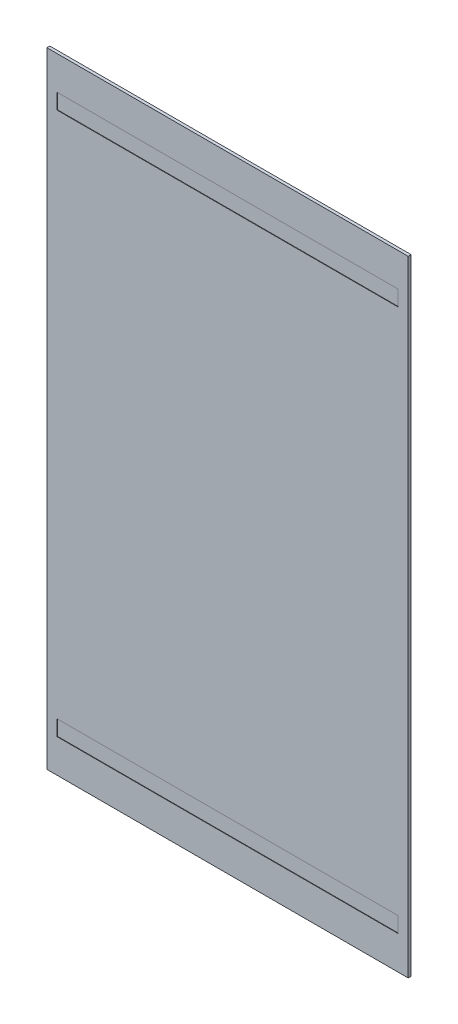
ISO-10303-21;
HEADER;
FILE_DESCRIPTION(('STEP AP214'),'2;1');
FILE_NAME('part.step','',(''),(''),'','','');
FILE_SCHEMA(('AUTOMOTIVE_DESIGN { 1 0 10303 214 1 1 1 1 }'));
ENDSEC;
DATA;
#1=APPLICATION_CONTEXT('core data for automotive mechanical design processes');
#2=APPLICATION_PROTOCOL_DEFINITION('international standard','automotive_design',2000,#1);
#3=PRODUCT_CONTEXT('',#1,'mechanical');
#4=PRODUCT('Part','Part','',(#3));
#5=PRODUCT_RELATED_PRODUCT_CATEGORY('part','',(#4));
#6=PRODUCT_DEFINITION_FORMATION('','',#4);
#7=PRODUCT_DEFINITION_CONTEXT('part definition',#1,'design');
#8=PRODUCT_DEFINITION('design','',#6,#7);
#9=PRODUCT_DEFINITION_SHAPE('','',#8);
#10=(LENGTH_UNIT() NAMED_UNIT(*) SI_UNIT(.MILLI.,.METRE.));
#11=(NAMED_UNIT(*) PLANE_ANGLE_UNIT() SI_UNIT($,.RADIAN.));
#12=(NAMED_UNIT(*) SI_UNIT($,.STERADIAN.) SOLID_ANGLE_UNIT());
#13=UNCERTAINTY_MEASURE_WITH_UNIT(LENGTH_MEASURE(1.E-05),#10,'distance_accuracy_value','');
#14=(GEOMETRIC_REPRESENTATION_CONTEXT(3) GLOBAL_UNCERTAINTY_ASSIGNED_CONTEXT((#13)) GLOBAL_UNIT_ASSIGNED_CONTEXT((#10,
#11,#12)) REPRESENTATION_CONTEXT('',''));
#15=CARTESIAN_POINT('',(0.,0.,0.));
#16=DIRECTION('',(0.,0.,1.));
#17=DIRECTION('',(1.,0.,0.));
#18=AXIS2_PLACEMENT_3D('',#15,#16,#17);
#19=CARTESIAN_POINT('',(-18.5,32.,0.3));
#20=DIRECTION('',(1.,0.,0.));
#21=DIRECTION('',(0.,0.,-1.));
#22=AXIS2_PLACEMENT_3D('',#19,#20,#21);
#23=PLANE('',#22);
#24=DIRECTION('',(0.,-1.,0.));
#25=VECTOR('',#24,1.);
#26=CARTESIAN_POINT('',(-18.5,32.,0.));
#27=LINE('',#26,#25);
#28=CARTESIAN_POINT('',(-18.5,32.,0.));
#29=VERTEX_POINT('',#28);
#30=CARTESIAN_POINT('',(-18.5,-32.,0.));
#31=VERTEX_POINT('',#30);
#32=EDGE_CURVE('E182',#29,#31,#27,.T.);
#33=ORIENTED_EDGE('',*,*,#32,.T.);
#34=DIRECTION('',(0.,0.,-1.));
#35=VECTOR('',#34,1.);
#36=CARTESIAN_POINT('',(-18.5,-32.,0.3));
#37=LINE('',#36,#35);
#38=CARTESIAN_POINT('',(-18.5,-32.,0.3));
#39=VERTEX_POINT('',#38);
#40=EDGE_CURVE('E11',#39,#31,#37,.T.);
#41=ORIENTED_EDGE('',*,*,#40,.F.);
#42=DIRECTION('',(0.,-1.,0.));
#43=VECTOR('',#42,1.);
#44=CARTESIAN_POINT('',(-18.5,32.,0.3));
#45=LINE('',#44,#43);
#46=CARTESIAN_POINT('',(-18.5,32.,0.3));
#47=VERTEX_POINT('',#46);
#48=EDGE_CURVE('E196',#47,#39,#45,.T.);
#49=ORIENTED_EDGE('',*,*,#48,.F.);
#50=DIRECTION('',(0.,0.,-1.));
#51=VECTOR('',#50,1.);
#52=CARTESIAN_POINT('',(-18.5,32.,0.3));
#53=LINE('',#52,#51);
#54=EDGE_CURVE('E205',#47,#29,#53,.T.);
#55=ORIENTED_EDGE('',*,*,#54,.T.);
#56=EDGE_LOOP('',(#33,#41,#49,#55));
#57=FACE_BOUND('',#56,.T.);
#58=ADVANCED_FACE('F29',(#57),#23,.F.);
#59=CARTESIAN_POINT('',(-18.5,-32.,0.3));
#60=DIRECTION('',(0.,1.,0.));
#61=DIRECTION('',(0.,0.,1.));
#62=AXIS2_PLACEMENT_3D('',#59,#60,#61);
#63=PLANE('',#62);
#64=DIRECTION('',(1.,0.,0.));
#65=VECTOR('',#64,1.);
#66=CARTESIAN_POINT('',(-18.5,-32.,0.));
#67=LINE('',#66,#65);
#68=CARTESIAN_POINT('',(18.5,-32.,0.));
#69=VERTEX_POINT('',#68);
#70=EDGE_CURVE('E190',#31,#69,#67,.T.);
#71=ORIENTED_EDGE('',*,*,#70,.T.);
#72=DIRECTION('',(0.,0.,-1.));
#73=VECTOR('',#72,1.);
#74=CARTESIAN_POINT('',(18.5,-32.,0.3));
#75=LINE('',#74,#73);
#76=CARTESIAN_POINT('',(18.5,-32.,0.3));
#77=VERTEX_POINT('',#76);
#78=EDGE_CURVE('E36',#77,#69,#75,.T.);
#79=ORIENTED_EDGE('',*,*,#78,.F.);
#80=DIRECTION('',(1.,0.,0.));
#81=VECTOR('',#80,1.);
#82=CARTESIAN_POINT('',(-18.5,-32.,0.3));
#83=LINE('',#82,#81);
#84=EDGE_CURVE('E199',#39,#77,#83,.T.);
#85=ORIENTED_EDGE('',*,*,#84,.F.);
#86=ORIENTED_EDGE('',*,*,#40,.T.);
#87=EDGE_LOOP('',(#71,#79,#85,#86));
#88=FACE_BOUND('',#87,.T.);
#89=ADVANCED_FACE('F230',(#88),#63,.F.);
#90=CARTESIAN_POINT('',(18.5,32.,0.3));
#91=DIRECTION('',(-1.,0.,0.));
#92=DIRECTION('',(0.,-1.,0.));
#93=AXIS2_PLACEMENT_3D('',#90,#91,#92);
#94=PLANE('',#93);
#95=DIRECTION('',(0.,1.,0.));
#96=VECTOR('',#95,1.);
#97=CARTESIAN_POINT('',(18.5,32.,0.));
#98=LINE('',#97,#96);
#99=CARTESIAN_POINT('',(18.5,32.,0.));
#100=VERTEX_POINT('',#99);
#101=EDGE_CURVE('E192',#69,#100,#98,.T.);
#102=ORIENTED_EDGE('',*,*,#101,.T.);
#103=DIRECTION('',(0.,0.,-1.));
#104=VECTOR('',#103,1.);
#105=CARTESIAN_POINT('',(18.5,32.,0.3));
#106=LINE('',#105,#104);
#107=CARTESIAN_POINT('',(18.5,32.,0.3));
#108=VERTEX_POINT('',#107);
#109=EDGE_CURVE('E208',#108,#100,#106,.T.);
#110=ORIENTED_EDGE('',*,*,#109,.F.);
#111=DIRECTION('',(0.,1.,0.));
#112=VECTOR('',#111,1.);
#113=CARTESIAN_POINT('',(18.5,32.,0.3));
#114=LINE('',#113,#112);
#115=EDGE_CURVE('E201',#77,#108,#114,.T.);
#116=ORIENTED_EDGE('',*,*,#115,.F.);
#117=ORIENTED_EDGE('',*,*,#78,.T.);
#118=EDGE_LOOP('',(#102,#110,#116,#117));
#119=FACE_BOUND('',#118,.T.);
#120=ADVANCED_FACE('F215',(#119),#94,.F.);
#121=CARTESIAN_POINT('',(-18.5,32.,0.3));
#122=DIRECTION('',(0.,-1.,0.));
#123=DIRECTION('',(0.,0.,-1.));
#124=AXIS2_PLACEMENT_3D('',#121,#122,#123);
#125=PLANE('',#124);
#126=DIRECTION('',(-1.,0.,0.));
#127=VECTOR('',#126,1.);
#128=CARTESIAN_POINT('',(-18.5,32.,0.));
#129=LINE('',#128,#127);
#130=EDGE_CURVE('E194',#100,#29,#129,.T.);
#131=ORIENTED_EDGE('',*,*,#130,.T.);
#132=ORIENTED_EDGE('',*,*,#54,.F.);
#133=DIRECTION('',(-1.,0.,0.));
#134=VECTOR('',#133,1.);
#135=CARTESIAN_POINT('',(-18.5,32.,0.3));
#136=LINE('',#135,#134);
#137=EDGE_CURVE('E203',#108,#47,#136,.T.);
#138=ORIENTED_EDGE('',*,*,#137,.F.);
#139=ORIENTED_EDGE('',*,*,#109,.T.);
#140=EDGE_LOOP('',(#131,#132,#138,#139));
#141=FACE_BOUND('',#140,.T.);
#142=ADVANCED_FACE('F224',(#141),#125,.F.);
#143=CARTESIAN_POINT('',(-18.5,-32.,0.3));
#144=DIRECTION('',(0.,0.,1.));
#145=DIRECTION('',(1.,0.,0.));
#146=AXIS2_PLACEMENT_3D('',#143,#144,#145);
#147=PLANE('',#146);
#148=DIRECTION('',(-1.,0.,0.));
#149=VECTOR('',#148,1.);
#150=CARTESIAN_POINT('',(-17.4625,-26.9875,0.3));
#151=LINE('',#150,#149);
#152=CARTESIAN_POINT('',(17.4625,-26.9875,0.3));
#153=VERTEX_POINT('',#152);
#154=CARTESIAN_POINT('',(-17.4625,-26.9875,0.3));
#155=VERTEX_POINT('',#154);
#156=EDGE_CURVE('E139',#153,#155,#151,.T.);
#157=ORIENTED_EDGE('',*,*,#156,.F.);
#158=DIRECTION('',(0.,1.,0.));
#159=VECTOR('',#158,1.);
#160=CARTESIAN_POINT('',(17.4625,-26.9875,0.3));
#161=LINE('',#160,#159);
#162=CARTESIAN_POINT('',(17.4625,-28.575,0.3));
#163=VERTEX_POINT('',#162);
#164=EDGE_CURVE('E121',#163,#153,#161,.T.);
#165=ORIENTED_EDGE('',*,*,#164,.F.);
#166=DIRECTION('',(1.,0.,0.));
#167=VECTOR('',#166,1.);
#168=CARTESIAN_POINT('',(-17.4625,-28.575,0.3));
#169=LINE('',#168,#167);
#170=CARTESIAN_POINT('',(-17.4625,-28.575,0.3));
#171=VERTEX_POINT('',#170);
#172=EDGE_CURVE('E132',#171,#163,#169,.T.);
#173=ORIENTED_EDGE('',*,*,#172,.F.);
#174=DIRECTION('',(0.,-1.,0.));
#175=VECTOR('',#174,1.);
#176=CARTESIAN_POINT('',(-17.4625,-26.9875,0.3));
#177=LINE('',#176,#175);
#178=EDGE_CURVE('E43',#155,#171,#177,.T.);
#179=ORIENTED_EDGE('',*,*,#178,.F.);
#180=EDGE_LOOP('',(#157,#165,#173,#179));
#181=FACE_BOUND('',#180,.T.);
#182=DIRECTION('',(-1.,0.,0.));
#183=VECTOR('',#182,1.);
#184=CARTESIAN_POINT('',(-17.4625,28.575,0.3));
#185=LINE('',#184,#183);
#186=CARTESIAN_POINT('',(17.4625,28.575,0.3));
#187=VERTEX_POINT('',#186);
#188=CARTESIAN_POINT('',(-17.4625,28.575,0.3));
#189=VERTEX_POINT('',#188);
#190=EDGE_CURVE('E164',#187,#189,#185,.T.);
#191=ORIENTED_EDGE('',*,*,#190,.F.);
#192=DIRECTION('',(0.,1.,0.));
#193=VECTOR('',#192,1.);
#194=CARTESIAN_POINT('',(17.4625,28.575,0.3));
#195=LINE('',#194,#193);
#196=CARTESIAN_POINT('',(17.4625,26.9875,0.3));
#197=VERTEX_POINT('',#196);
#198=EDGE_CURVE('E161',#197,#187,#195,.T.);
#199=ORIENTED_EDGE('',*,*,#198,.F.);
#200=DIRECTION('',(1.,0.,0.));
#201=VECTOR('',#200,1.);
#202=CARTESIAN_POINT('',(-17.4625,26.9875,0.3));
#203=LINE('',#202,#201);
#204=CARTESIAN_POINT('',(-17.4625,26.9875,0.3));
#205=VERTEX_POINT('',#204);
#206=EDGE_CURVE('E158',#205,#197,#203,.T.);
#207=ORIENTED_EDGE('',*,*,#206,.F.);
#208=DIRECTION('',(0.,-1.,0.));
#209=VECTOR('',#208,1.);
#210=CARTESIAN_POINT('',(-17.4625,28.575,0.3));
#211=LINE('',#210,#209);
#212=EDGE_CURVE('E51',#189,#205,#211,.T.);
#213=ORIENTED_EDGE('',*,*,#212,.F.);
#214=EDGE_LOOP('',(#191,#199,#207,#213));
#215=FACE_BOUND('',#214,.T.);
#216=ORIENTED_EDGE('',*,*,#48,.T.);
#217=ORIENTED_EDGE('',*,*,#84,.T.);
#218=ORIENTED_EDGE('',*,*,#115,.T.);
#219=ORIENTED_EDGE('',*,*,#137,.T.);
#220=EDGE_LOOP('',(#216,#217,#218,#219));
#221=FACE_BOUND('',#220,.T.);
#222=ADVANCED_FACE('F136',(#181,#215,#221),#147,.T.);
#223=CARTESIAN_POINT('',(-18.5,-32.,0.));
#224=DIRECTION('',(0.,0.,1.));
#225=DIRECTION('',(1.,0.,0.));
#226=AXIS2_PLACEMENT_3D('',#223,#224,#225);
#227=PLANE('',#226);
#228=ORIENTED_EDGE('',*,*,#32,.F.);
#229=ORIENTED_EDGE('',*,*,#130,.F.);
#230=ORIENTED_EDGE('',*,*,#101,.F.);
#231=ORIENTED_EDGE('',*,*,#70,.F.);
#232=EDGE_LOOP('',(#228,#229,#230,#231));
#233=FACE_BOUND('',#232,.T.);
#234=ADVANCED_FACE('F221',(#233),#227,.F.);
#235=CARTESIAN_POINT('',(-17.4625,28.575,0.25));
#236=DIRECTION('',(-1.,0.,0.));
#237=DIRECTION('',(0.,0.,1.));
#238=AXIS2_PLACEMENT_3D('',#235,#236,#237);
#239=PLANE('',#238);
#240=ORIENTED_EDGE('',*,*,#212,.T.);
#241=DIRECTION('',(0.,0.,1.));
#242=VECTOR('',#241,1.);
#243=CARTESIAN_POINT('',(-17.4625,26.9875,0.25));
#244=LINE('',#243,#242);
#245=CARTESIAN_POINT('',(-17.4625,26.9875,0.25));
#246=VERTEX_POINT('',#245);
#247=EDGE_CURVE('E179',#246,#205,#244,.T.);
#248=ORIENTED_EDGE('',*,*,#247,.F.);
#249=DIRECTION('',(0.,-1.,0.));
#250=VECTOR('',#249,1.);
#251=CARTESIAN_POINT('',(-17.4625,28.575,0.25));
#252=LINE('',#251,#250);
#253=CARTESIAN_POINT('',(-17.4625,28.575,0.25));
#254=VERTEX_POINT('',#253);
#255=EDGE_CURVE('E167',#254,#246,#252,.T.);
#256=ORIENTED_EDGE('',*,*,#255,.F.);
#257=DIRECTION('',(0.,0.,1.));
#258=VECTOR('',#257,1.);
#259=CARTESIAN_POINT('',(-17.4625,28.575,0.25));
#260=LINE('',#259,#258);
#261=EDGE_CURVE('E180',#254,#189,#260,.T.);
#262=ORIENTED_EDGE('',*,*,#261,.T.);
#263=EDGE_LOOP('',(#240,#248,#256,#262));
#264=FACE_BOUND('',#263,.T.);
#265=ADVANCED_FACE('F244',(#264),#239,.F.);
#266=CARTESIAN_POINT('',(-17.4625,28.575,0.25));
#267=DIRECTION('',(0.,1.,0.));
#268=DIRECTION('',(0.,0.,1.));
#269=AXIS2_PLACEMENT_3D('',#266,#267,#268);
#270=PLANE('',#269);
#271=ORIENTED_EDGE('',*,*,#190,.T.);
#272=ORIENTED_EDGE('',*,*,#261,.F.);
#273=DIRECTION('',(-1.,0.,0.));
#274=VECTOR('',#273,1.);
#275=CARTESIAN_POINT('',(-17.4625,28.575,0.25));
#276=LINE('',#275,#274);
#277=CARTESIAN_POINT('',(17.4625,28.575,0.25));
#278=VERTEX_POINT('',#277);
#279=EDGE_CURVE('E176',#278,#254,#276,.T.);
#280=ORIENTED_EDGE('',*,*,#279,.F.);
#281=DIRECTION('',(0.,0.,1.));
#282=VECTOR('',#281,1.);
#283=CARTESIAN_POINT('',(17.4625,28.575,0.25));
#284=LINE('',#283,#282);
#285=EDGE_CURVE('E183',#278,#187,#284,.T.);
#286=ORIENTED_EDGE('',*,*,#285,.T.);
#287=EDGE_LOOP('',(#271,#272,#280,#286));
#288=FACE_BOUND('',#287,.T.);
#289=ADVANCED_FACE('F247',(#288),#270,.F.);
#290=CARTESIAN_POINT('',(17.4625,28.575,0.25));
#291=DIRECTION('',(1.,0.,0.));
#292=DIRECTION('',(0.,0.,-1.));
#293=AXIS2_PLACEMENT_3D('',#290,#291,#292);
#294=PLANE('',#293);
#295=ORIENTED_EDGE('',*,*,#198,.T.);
#296=ORIENTED_EDGE('',*,*,#285,.F.);
#297=DIRECTION('',(0.,1.,0.));
#298=VECTOR('',#297,1.);
#299=CARTESIAN_POINT('',(17.4625,28.575,0.25));
#300=LINE('',#299,#298);
#301=CARTESIAN_POINT('',(17.4625,26.9875,0.25));
#302=VERTEX_POINT('',#301);
#303=EDGE_CURVE('E173',#302,#278,#300,.T.);
#304=ORIENTED_EDGE('',*,*,#303,.F.);
#305=DIRECTION('',(0.,0.,1.));
#306=VECTOR('',#305,1.);
#307=CARTESIAN_POINT('',(17.4625,26.9875,0.25));
#308=LINE('',#307,#306);
#309=EDGE_CURVE('E185',#302,#197,#308,.T.);
#310=ORIENTED_EDGE('',*,*,#309,.T.);
#311=EDGE_LOOP('',(#295,#296,#304,#310));
#312=FACE_BOUND('',#311,.T.);
#313=ADVANCED_FACE('F252',(#312),#294,.F.);
#314=CARTESIAN_POINT('',(-17.4625,26.9875,0.25));
#315=DIRECTION('',(0.,-1.,0.));
#316=DIRECTION('',(0.,0.,-1.));
#317=AXIS2_PLACEMENT_3D('',#314,#315,#316);
#318=PLANE('',#317);
#319=ORIENTED_EDGE('',*,*,#206,.T.);
#320=ORIENTED_EDGE('',*,*,#309,.F.);
#321=DIRECTION('',(1.,0.,0.));
#322=VECTOR('',#321,1.);
#323=CARTESIAN_POINT('',(-17.4625,26.9875,0.25));
#324=LINE('',#323,#322);
#325=EDGE_CURVE('E170',#246,#302,#324,.T.);
#326=ORIENTED_EDGE('',*,*,#325,.F.);
#327=ORIENTED_EDGE('',*,*,#247,.T.);
#328=EDGE_LOOP('',(#319,#320,#326,#327));
#329=FACE_BOUND('',#328,.T.);
#330=ADVANCED_FACE('F248',(#329),#318,.F.);
#331=CARTESIAN_POINT('',(-17.4625,26.9875,0.25));
#332=DIRECTION('',(0.,0.,1.));
#333=DIRECTION('',(1.,0.,0.));
#334=AXIS2_PLACEMENT_3D('',#331,#332,#333);
#335=PLANE('',#334);
#336=ORIENTED_EDGE('',*,*,#255,.T.);
#337=ORIENTED_EDGE('',*,*,#325,.T.);
#338=ORIENTED_EDGE('',*,*,#303,.T.);
#339=ORIENTED_EDGE('',*,*,#279,.T.);
#340=EDGE_LOOP('',(#336,#337,#338,#339));
#341=FACE_BOUND('',#340,.T.);
#342=ADVANCED_FACE('F251',(#341),#335,.T.);
#343=CARTESIAN_POINT('',(-17.4625,-26.9875,0.25));
#344=DIRECTION('',(-1.,0.,0.));
#345=DIRECTION('',(0.,0.,1.));
#346=AXIS2_PLACEMENT_3D('',#343,#344,#345);
#347=PLANE('',#346);
#348=ORIENTED_EDGE('',*,*,#178,.T.);
#349=DIRECTION('',(0.,0.,1.));
#350=VECTOR('',#349,1.);
#351=CARTESIAN_POINT('',(-17.4625,-28.575,0.25));
#352=LINE('',#351,#350);
#353=CARTESIAN_POINT('',(-17.4625,-28.575,0.25));
#354=VERTEX_POINT('',#353);
#355=EDGE_CURVE('E129',#354,#171,#352,.T.);
#356=ORIENTED_EDGE('',*,*,#355,.F.);
#357=DIRECTION('',(0.,-1.,0.));
#358=VECTOR('',#357,1.);
#359=CARTESIAN_POINT('',(-17.4625,-26.9875,0.25));
#360=LINE('',#359,#358);
#361=CARTESIAN_POINT('',(-17.4625,-26.9875,0.25));
#362=VERTEX_POINT('',#361);
#363=EDGE_CURVE('E141',#362,#354,#360,.T.);
#364=ORIENTED_EDGE('',*,*,#363,.F.);
#365=DIRECTION('',(0.,0.,1.));
#366=VECTOR('',#365,1.);
#367=CARTESIAN_POINT('',(-17.4625,-26.9875,0.25));
#368=LINE('',#367,#366);
#369=EDGE_CURVE('E153',#362,#155,#368,.T.);
#370=ORIENTED_EDGE('',*,*,#369,.T.);
#371=EDGE_LOOP('',(#348,#356,#364,#370));
#372=FACE_BOUND('',#371,.T.);
#373=ADVANCED_FACE('F262',(#372),#347,.F.);
#374=CARTESIAN_POINT('',(-17.4625,-26.9875,0.25));
#375=DIRECTION('',(0.,1.,0.));
#376=DIRECTION('',(0.,0.,1.));
#377=AXIS2_PLACEMENT_3D('',#374,#375,#376);
#378=PLANE('',#377);
#379=ORIENTED_EDGE('',*,*,#156,.T.);
#380=ORIENTED_EDGE('',*,*,#369,.F.);
#381=DIRECTION('',(-1.,0.,0.));
#382=VECTOR('',#381,1.);
#383=CARTESIAN_POINT('',(-17.4625,-26.9875,0.25));
#384=LINE('',#383,#382);
#385=CARTESIAN_POINT('',(17.4625,-26.9875,0.25));
#386=VERTEX_POINT('',#385);
#387=EDGE_CURVE('E150',#386,#362,#384,.T.);
#388=ORIENTED_EDGE('',*,*,#387,.F.);
#389=DIRECTION('',(0.,0.,1.));
#390=VECTOR('',#389,1.);
#391=CARTESIAN_POINT('',(17.4625,-26.9875,0.25));
#392=LINE('',#391,#390);
#393=EDGE_CURVE('E128',#386,#153,#392,.T.);
#394=ORIENTED_EDGE('',*,*,#393,.T.);
#395=EDGE_LOOP('',(#379,#380,#388,#394));
#396=FACE_BOUND('',#395,.T.);
#397=ADVANCED_FACE('F266',(#396),#378,.F.);
#398=CARTESIAN_POINT('',(17.4625,-26.9875,0.25));
#399=DIRECTION('',(1.,0.,0.));
#400=DIRECTION('',(0.,0.,-1.));
#401=AXIS2_PLACEMENT_3D('',#398,#399,#400);
#402=PLANE('',#401);
#403=ORIENTED_EDGE('',*,*,#164,.T.);
#404=ORIENTED_EDGE('',*,*,#393,.F.);
#405=DIRECTION('',(0.,1.,0.));
#406=VECTOR('',#405,1.);
#407=CARTESIAN_POINT('',(17.4625,-26.9875,0.25));
#408=LINE('',#407,#406);
#409=CARTESIAN_POINT('',(17.4625,-28.575,0.25));
#410=VERTEX_POINT('',#409);
#411=EDGE_CURVE('E124',#410,#386,#408,.T.);
#412=ORIENTED_EDGE('',*,*,#411,.F.);
#413=DIRECTION('',(0.,0.,1.));
#414=VECTOR('',#413,1.);
#415=CARTESIAN_POINT('',(17.4625,-28.575,0.25));
#416=LINE('',#415,#414);
#417=EDGE_CURVE('E117',#410,#163,#416,.T.);
#418=ORIENTED_EDGE('',*,*,#417,.T.);
#419=EDGE_LOOP('',(#403,#404,#412,#418));
#420=FACE_BOUND('',#419,.T.);
#421=ADVANCED_FACE('F119',(#420),#402,.F.);
#422=CARTESIAN_POINT('',(-17.4625,-28.575,0.25));
#423=DIRECTION('',(0.,-1.,0.));
#424=DIRECTION('',(0.,0.,-1.));
#425=AXIS2_PLACEMENT_3D('',#422,#423,#424);
#426=PLANE('',#425);
#427=ORIENTED_EDGE('',*,*,#172,.T.);
#428=ORIENTED_EDGE('',*,*,#417,.F.);
#429=DIRECTION('',(1.,0.,0.));
#430=VECTOR('',#429,1.);
#431=CARTESIAN_POINT('',(-17.4625,-28.575,0.25));
#432=LINE('',#431,#430);
#433=EDGE_CURVE('E147',#354,#410,#432,.T.);
#434=ORIENTED_EDGE('',*,*,#433,.F.);
#435=ORIENTED_EDGE('',*,*,#355,.T.);
#436=EDGE_LOOP('',(#427,#428,#434,#435));
#437=FACE_BOUND('',#436,.T.);
#438=ADVANCED_FACE('F133',(#437),#426,.F.);
#439=CARTESIAN_POINT('',(-17.4625,-28.575,0.25));
#440=DIRECTION('',(0.,0.,1.));
#441=DIRECTION('',(1.,0.,0.));
#442=AXIS2_PLACEMENT_3D('',#439,#440,#441);
#443=PLANE('',#442);
#444=ORIENTED_EDGE('',*,*,#363,.T.);
#445=ORIENTED_EDGE('',*,*,#433,.T.);
#446=ORIENTED_EDGE('',*,*,#411,.T.);
#447=ORIENTED_EDGE('',*,*,#387,.T.);
#448=EDGE_LOOP('',(#444,#445,#446,#447));
#449=FACE_BOUND('',#448,.T.);
#450=ADVANCED_FACE('F269',(#449),#443,.T.);
#451=CLOSED_SHELL('',(#58,#89,#120,#142,#222,#234,#265,#289,#313,#330,#342,#373,#397,#421,#438,#450));
#452=MANIFOLD_SOLID_BREP('B2',#451);
#453=ADVANCED_BREP_SHAPE_REPRESENTATION('',(#18,#452),#14);
#454=SHAPE_DEFINITION_REPRESENTATION(#9,#453);
ENDSEC;
END-ISO-10303-21;
